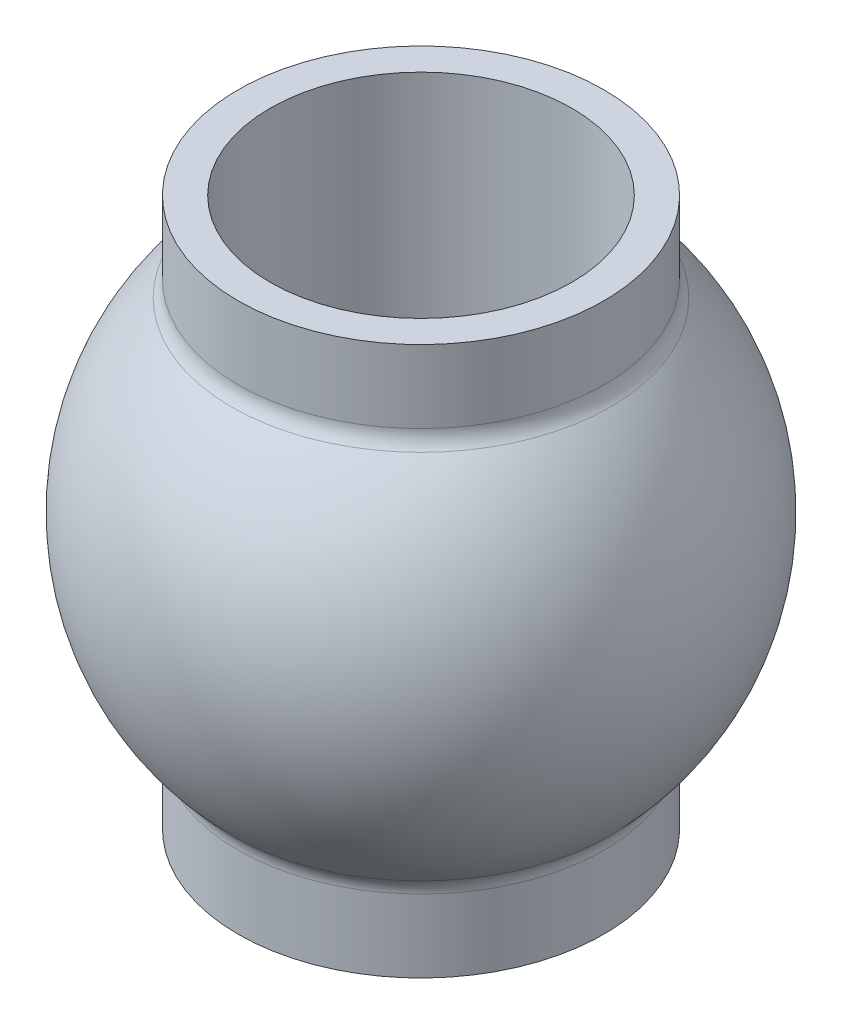
ISO-10303-21;
HEADER;
FILE_DESCRIPTION(('STEP AP214'),'2;1');
FILE_NAME('part.step','',(''),(''),'','','');
FILE_SCHEMA(('AUTOMOTIVE_DESIGN { 1 0 10303 214 1 1 1 1 }'));
ENDSEC;
DATA;
#1=APPLICATION_CONTEXT('core data for automotive mechanical design processes');
#2=APPLICATION_PROTOCOL_DEFINITION('international standard','automotive_design',2000,#1);
#3=PRODUCT_CONTEXT('',#1,'mechanical');
#4=PRODUCT('Part','Part','',(#3));
#5=PRODUCT_RELATED_PRODUCT_CATEGORY('part','',(#4));
#6=PRODUCT_DEFINITION_FORMATION('','',#4);
#7=PRODUCT_DEFINITION_CONTEXT('part definition',#1,'design');
#8=PRODUCT_DEFINITION('design','',#6,#7);
#9=PRODUCT_DEFINITION_SHAPE('','',#8);
#10=(LENGTH_UNIT() NAMED_UNIT(*) SI_UNIT(.MILLI.,.METRE.));
#11=(NAMED_UNIT(*) PLANE_ANGLE_UNIT() SI_UNIT($,.RADIAN.));
#12=(NAMED_UNIT(*) SI_UNIT($,.STERADIAN.) SOLID_ANGLE_UNIT());
#13=UNCERTAINTY_MEASURE_WITH_UNIT(LENGTH_MEASURE(1.E-05),#10,'distance_accuracy_value','');
#14=(GEOMETRIC_REPRESENTATION_CONTEXT(3) GLOBAL_UNCERTAINTY_ASSIGNED_CONTEXT((#13)) GLOBAL_UNIT_ASSIGNED_CONTEXT((#10,
#11,#12)) REPRESENTATION_CONTEXT('',''));
#15=CARTESIAN_POINT('',(0.,0.,0.));
#16=DIRECTION('',(0.,0.,1.));
#17=DIRECTION('',(1.,0.,0.));
#18=AXIS2_PLACEMENT_3D('',#15,#16,#17);
#19=CARTESIAN_POINT('',(0.,3.,0.));
#20=DIRECTION('',(0.,-1.,0.));
#21=DIRECTION('',(0.,0.,-1.));
#22=AXIS2_PLACEMENT_3D('',#19,#20,#21);
#23=PLANE('',#22);
#24=CARTESIAN_POINT('',(0.,3.,0.));
#25=DIRECTION('',(0.,1.,0.));
#26=DIRECTION('',(0.,0.,1.));
#27=AXIS2_PLACEMENT_3D('',#24,#25,#26);
#28=CIRCLE('',#27,1.65);
#29=CARTESIAN_POINT('',(0.,3.,1.65));
#30=VERTEX_POINT('',#29);
#31=EDGE_CURVE('E57',#30,#30,#28,.T.);
#32=ORIENTED_EDGE('',*,*,#31,.F.);
#33=EDGE_LOOP('',(#32));
#34=FACE_BOUND('',#33,.T.);
#35=CARTESIAN_POINT('',(0.,3.,0.));
#36=DIRECTION('',(0.,1.,0.));
#37=DIRECTION('',(0.,0.,1.));
#38=AXIS2_PLACEMENT_3D('',#35,#36,#37);
#39=CIRCLE('',#38,2.);
#40=CARTESIAN_POINT('',(0.,3.,2.));
#41=VERTEX_POINT('',#40);
#42=EDGE_CURVE('E50',#41,#41,#39,.T.);
#43=ORIENTED_EDGE('',*,*,#42,.T.);
#44=EDGE_LOOP('',(#43));
#45=FACE_BOUND('',#44,.T.);
#46=ADVANCED_FACE('F30',(#34,#45),#23,.F.);
#47=CARTESIAN_POINT('',(0.,4.18355431277578,0.));
#48=DIRECTION('',(0.,1.,0.));
#49=DIRECTION('',(0.,0.,1.));
#50=AXIS2_PLACEMENT_3D('',#47,#48,#49);
#51=CYLINDRICAL_SURFACE('',#50,2.);
#52=CARTESIAN_POINT('',(0.,2.20454076850486,0.));
#53=DIRECTION('',(0.,-1.,0.));
#54=DIRECTION('',(0.,0.,-1.));
#55=AXIS2_PLACEMENT_3D('',#52,#53,#54);
#56=CIRCLE('',#55,2.);
#57=CARTESIAN_POINT('',(0.,2.20454076850486,-2.));
#58=VERTEX_POINT('',#57);
#59=EDGE_CURVE('E10',#58,#58,#56,.F.);
#60=ORIENTED_EDGE('',*,*,#59,.T.);
#61=EDGE_LOOP('',(#60));
#62=FACE_BOUND('',#61,.T.);
#63=ORIENTED_EDGE('',*,*,#42,.F.);
#64=EDGE_LOOP('',(#63));
#65=FACE_BOUND('',#64,.T.);
#66=ADVANCED_FACE('F75',(#62,#65),#51,.T.);
#67=CARTESIAN_POINT('',(0.,0.,0.));
#68=DIRECTION('',(0.,1.,0.));
#69=DIRECTION('',(1.,0.,0.));
#70=AXIS2_PLACEMENT_3D('',#67,#68,#69);
#71=SPHERICAL_SURFACE('',#70,2.9);
#72=CARTESIAN_POINT('',(0.,-2.02957721544892,0.));
#73=DIRECTION('',(0.,1.,0.));
#74=DIRECTION('',(0.,0.,1.));
#75=AXIS2_PLACEMENT_3D('',#72,#73,#74);
#76=CIRCLE('',#75,2.07142857142857);
#77=CARTESIAN_POINT('',(2.07142857142857,-2.02957721544892,0.));
#78=VERTEX_POINT('',#77);
#79=EDGE_CURVE('E41',#78,#78,#76,.T.);
#80=CARTESIAN_POINT('',(0.,2.02957721544892,0.));
#81=DIRECTION('',(0.,-1.,0.));
#82=DIRECTION('',(0.,0.,-1.));
#83=AXIS2_PLACEMENT_3D('',#80,#81,#82);
#84=CIRCLE('',#83,2.07142857142857);
#85=CARTESIAN_POINT('',(2.07142857142857,2.02957721544892,0.));
#86=VERTEX_POINT('',#85);
#87=EDGE_CURVE('E45',#86,#86,#84,.T.);
#88=CARTESIAN_POINT('',(2.07142857142857,-2.02957721544892,0.));
#89=CARTESIAN_POINT('',(2.10420667702198,-1.99612456649257,0.));
#90=CARTESIAN_POINT('',(2.13617298715975,-1.96187663599803,0.));
#91=CARTESIAN_POINT('',(2.19841013291631,-1.89187337861782,0.));
#92=CARTESIAN_POINT('',(2.22868096853511,-1.85611805173215,0.));
#93=CARTESIAN_POINT('',(2.28745528164607,-1.78318316825493,0.));
#94=CARTESIAN_POINT('',(2.31595875913823,-1.74600361166338,0.));
#95=CARTESIAN_POINT('',(2.37113168640728,-1.67030772591639,0.));
#96=CARTESIAN_POINT('',(2.39780113618417,-1.63179139676095,0.));
#97=CARTESIAN_POINT('',(2.44924335703204,-1.55351230630763,0.));
#98=CARTESIAN_POINT('',(2.47401612810302,-1.51374954500976,0.));
#99=CARTESIAN_POINT('',(2.52160686841956,-1.43307092400676,0.));
#100=CARTESIAN_POINT('',(2.54442483766512,-1.39215506430164,0.));
#101=CARTESIAN_POINT('',(2.58805241843058,-1.3092662681936,0.));
#102=CARTESIAN_POINT('',(2.60886202995047,-1.26729333179068,0.));
#103=CARTESIAN_POINT('',(2.64842405828161,-1.18238888973957,0.));
#104=CARTESIAN_POINT('',(2.66717647509285,-1.13945738409136,0.));
#105=CARTESIAN_POINT('',(2.70258010358794,-1.05273655936215,0.));
#106=CARTESIAN_POINT('',(2.71923131527179,-1.00894724028114,0.));
#107=CARTESIAN_POINT('',(2.75039345481303,-0.920613558054732,0.));
#108=CARTESIAN_POINT('',(2.76490438267043,-0.876069194909328,0.));
#109=CARTESIAN_POINT('',(2.791751898793,-0.786329965843888,0.));
#110=CARTESIAN_POINT('',(2.80408848705819,-0.741135099923851,0.));
#111=CARTESIAN_POINT('',(2.82655837122351,-0.650200933291157,0.));
#112=CARTESIAN_POINT('',(2.83669166712365,-0.604461632578498,0.));
#113=CARTESIAN_POINT('',(2.85473118469243,-0.512545942071595,0.));
#114=CARTESIAN_POINT('',(2.86263740636108,-0.466369552277349,0.));
#115=CARTESIAN_POINT('',(2.87620422033015,-0.373688055125888,0.));
#116=CARTESIAN_POINT('',(2.88186481263057,-0.327182947768672,0.));
#117=CARTESIAN_POINT('',(2.89092708300075,-0.233953158477716,0.));
#118=CARTESIAN_POINT('',(2.8943287610705,-0.187228476543975,0.));
#119=CARTESIAN_POINT('',(2.89886521957013,-0.0936691964068227,0.));
#120=CARTESIAN_POINT('',(2.9,-0.046834598203411,0.));
#121=CARTESIAN_POINT('',(2.9,0.0468345982034123,0.));
#122=CARTESIAN_POINT('',(2.89886521957013,0.093669196406824,0.));
#123=CARTESIAN_POINT('',(2.8943287610705,0.187228476543977,0.));
#124=CARTESIAN_POINT('',(2.89092708300075,0.233953158477717,0.));
#125=CARTESIAN_POINT('',(2.88186481263057,0.327182947768674,0.));
#126=CARTESIAN_POINT('',(2.87620422033015,0.373688055125889,0.));
#127=CARTESIAN_POINT('',(2.86263740636108,0.46636955227735,0.));
#128=CARTESIAN_POINT('',(2.85473118469243,0.512545942071596,0.));
#129=CARTESIAN_POINT('',(2.83669166712365,0.6044616325785,0.));
#130=CARTESIAN_POINT('',(2.82655837122351,0.650200933291158,0.));
#131=CARTESIAN_POINT('',(2.80408848705819,0.741135099923853,0.));
#132=CARTESIAN_POINT('',(2.791751898793,0.786329965843889,0.));
#133=CARTESIAN_POINT('',(2.76490438267043,0.87606919490933,0.));
#134=CARTESIAN_POINT('',(2.75039345481303,0.920613558054733,0.));
#135=CARTESIAN_POINT('',(2.71923131527179,1.00894724028115,0.));
#136=CARTESIAN_POINT('',(2.70258010358794,1.05273655936215,0.));
#137=CARTESIAN_POINT('',(2.66717647509285,1.13945738409137,0.));
#138=CARTESIAN_POINT('',(2.64842405828161,1.18238888973957,0.));
#139=CARTESIAN_POINT('',(2.60886202995047,1.26729333179069,0.));
#140=CARTESIAN_POINT('',(2.58805241843058,1.3092662681936,0.));
#141=CARTESIAN_POINT('',(2.54442483766512,1.39215506430164,0.));
#142=CARTESIAN_POINT('',(2.52160686841956,1.43307092400676,0.));
#143=CARTESIAN_POINT('',(2.47401612810302,1.51374954500976,0.));
#144=CARTESIAN_POINT('',(2.44924335703204,1.55351230630764,0.));
#145=CARTESIAN_POINT('',(2.39780113618417,1.63179139676095,0.));
#146=CARTESIAN_POINT('',(2.37113168640728,1.67030772591639,0.));
#147=CARTESIAN_POINT('',(2.31595875913823,1.74600361166338,0.));
#148=CARTESIAN_POINT('',(2.28745528164607,1.78318316825493,0.));
#149=CARTESIAN_POINT('',(2.22868096853511,1.85611805173215,0.));
#150=CARTESIAN_POINT('',(2.19841013291631,1.89187337861782,0.));
#151=CARTESIAN_POINT('',(2.13617298715975,1.96187663599803,0.));
#152=CARTESIAN_POINT('',(2.10420667702198,1.99612456649257,0.));
#153=CARTESIAN_POINT('',(2.07142857142857,2.02957721544892,0.));
#154=B_SPLINE_CURVE_WITH_KNOTS('',3,(#88,#89,#90,#91,#92,#93,#94,#95,#96,#97,#98,#99,#100,#101,
#102,#103,#104,#105,#106,#107,#108,#109,#110,#111,#112,#113,#114,#115,#116,#117,#118,#119,#120,
#121,#122,#123,#124,#125,#126,#127,#128,#129,#130,#131,#132,#133,#134,#135,#136,#137,#138,#139,
#140,#141,#142,#143,#144,#145,#146,#147,#148,#149,#150,#151,#152,#153),.UNSPECIFIED.,.F.,.F.,(4,
2,2,2,2,2,2,2,2,2,2,2,2,2,2,2,2,2,2,2,2,2,2,2,2,2,2,2,2,2,2,2,4),(0.,0.140490057093638,
0.280980114187275,0.421470171280913,0.561960228374551,0.702450285468188,0.842940342561826,
0.983430399655463,1.1239204567491,1.26441051384274,1.40490057093638,1.54539062803001,
1.68588068512365,1.82637074221729,1.96686079931093,2.10735085640456,2.2478409134982,
2.38833097059184,2.52882102768548,2.66931108477911,2.80980114187275,2.95029119896639,
3.09078125606003,3.23127131315367,3.3717613702473,3.51225142734094,3.65274148443458,
3.79323154152822,3.93372159862185,4.07421165571549,4.21470171280913,4.35519176990277,
4.4956818269964),.UNSPECIFIED.);
#155=EDGE_CURVE('BSEAM80',#78,#86,#154,.T.);
#156=ORIENTED_EDGE('',*,*,#79,.T.);
#157=ORIENTED_EDGE('',*,*,#87,.T.);
#158=ORIENTED_EDGE('',*,*,#155,.T.);
#159=ORIENTED_EDGE('',*,*,#155,.F.);
#160=EDGE_LOOP('',(#156,#158,#157,#159));
#161=FACE_BOUND('',#160,.T.);
#162=ADVANCED_FACE('F80',(#161),#71,.T.);
#163=CARTESIAN_POINT('',(0.,4.18355431277578,0.));
#164=DIRECTION('',(0.,1.,0.));
#165=DIRECTION('',(0.,0.,1.));
#166=AXIS2_PLACEMENT_3D('',#163,#164,#165);
#167=CYLINDRICAL_SURFACE('',#166,2.);
#168=CARTESIAN_POINT('',(0.,-2.20454076850486,0.));
#169=DIRECTION('',(0.,1.,0.));
#170=DIRECTION('',(0.,0.,1.));
#171=AXIS2_PLACEMENT_3D('',#168,#169,#170);
#172=CIRCLE('',#171,2.);
#173=CARTESIAN_POINT('',(0.,-2.20454076850486,2.));
#174=VERTEX_POINT('',#173);
#175=EDGE_CURVE('E37',#174,#174,#172,.F.);
#176=ORIENTED_EDGE('',*,*,#175,.T.);
#177=EDGE_LOOP('',(#176));
#178=FACE_BOUND('',#177,.T.);
#179=CARTESIAN_POINT('',(0.,-3.,0.));
#180=DIRECTION('',(0.,1.,0.));
#181=DIRECTION('',(0.,0.,1.));
#182=AXIS2_PLACEMENT_3D('',#179,#180,#181);
#183=CIRCLE('',#182,2.);
#184=CARTESIAN_POINT('',(0.,-3.,2.));
#185=VERTEX_POINT('',#184);
#186=EDGE_CURVE('E53',#185,#185,#183,.T.);
#187=ORIENTED_EDGE('',*,*,#186,.T.);
#188=EDGE_LOOP('',(#187));
#189=FACE_BOUND('',#188,.T.);
#190=ADVANCED_FACE('F85',(#178,#189),#167,.T.);
#191=CARTESIAN_POINT('',(2.,-3.,0.));
#192=DIRECTION('',(0.,1.,0.));
#193=DIRECTION('',(0.,0.,1.));
#194=AXIS2_PLACEMENT_3D('',#191,#192,#193);
#195=PLANE('',#194);
#196=CARTESIAN_POINT('',(0.,-3.,0.));
#197=DIRECTION('',(0.,1.,0.));
#198=DIRECTION('',(0.,0.,1.));
#199=AXIS2_PLACEMENT_3D('',#196,#197,#198);
#200=CIRCLE('',#199,1.65);
#201=CARTESIAN_POINT('',(0.,-3.,1.65));
#202=VERTEX_POINT('',#201);
#203=EDGE_CURVE('E56',#202,#202,#200,.T.);
#204=ORIENTED_EDGE('',*,*,#203,.T.);
#205=EDGE_LOOP('',(#204));
#206=FACE_BOUND('',#205,.T.);
#207=ORIENTED_EDGE('',*,*,#186,.F.);
#208=EDGE_LOOP('',(#207));
#209=FACE_BOUND('',#208,.T.);
#210=ADVANCED_FACE('F63',(#206,#209),#195,.F.);
#211=CARTESIAN_POINT('',(0.,-3.,0.));
#212=DIRECTION('',(0.,1.,0.));
#213=DIRECTION('',(0.,0.,1.));
#214=AXIS2_PLACEMENT_3D('',#211,#212,#213);
#215=CYLINDRICAL_SURFACE('',#214,1.65);
#216=ORIENTED_EDGE('',*,*,#203,.F.);
#217=EDGE_LOOP('',(#216));
#218=FACE_BOUND('',#217,.T.);
#219=ORIENTED_EDGE('',*,*,#31,.T.);
#220=EDGE_LOOP('',(#219));
#221=FACE_BOUND('',#220,.T.);
#222=ADVANCED_FACE('F66',(#218,#221),#215,.F.);
#223=CARTESIAN_POINT('',(0.,-2.20454076850486,0.));
#224=DIRECTION('',(0.,1.,0.));
#225=DIRECTION('',(0.,0.,1.));
#226=AXIS2_PLACEMENT_3D('',#223,#224,#225);
#227=TOROIDAL_SURFACE('',#226,2.25,0.25);
#228=ORIENTED_EDGE('',*,*,#175,.F.);
#229=EDGE_LOOP('',(#228));
#230=FACE_BOUND('',#229,.T.);
#231=ORIENTED_EDGE('',*,*,#79,.F.);
#232=EDGE_LOOP('',(#231));
#233=FACE_BOUND('',#232,.T.);
#234=ADVANCED_FACE('F69',(#230,#233),#227,.F.);
#235=CARTESIAN_POINT('',(0.,2.20454076850486,0.));
#236=DIRECTION('',(0.,-1.,0.));
#237=DIRECTION('',(0.,0.,-1.));
#238=AXIS2_PLACEMENT_3D('',#235,#236,#237);
#239=TOROIDAL_SURFACE('',#238,2.25,0.25);
#240=ORIENTED_EDGE('',*,*,#87,.F.);
#241=EDGE_LOOP('',(#240));
#242=FACE_BOUND('',#241,.T.);
#243=ORIENTED_EDGE('',*,*,#59,.F.);
#244=EDGE_LOOP('',(#243));
#245=FACE_BOUND('',#244,.T.);
#246=ADVANCED_FACE('F32',(#242,#245),#239,.F.);
#247=CLOSED_SHELL('',(#46,#66,#162,#190,#210,#222,#234,#246));
#248=MANIFOLD_SOLID_BREP('B2',#247);
#249=ADVANCED_BREP_SHAPE_REPRESENTATION('',(#18,#248),#14);
#250=SHAPE_DEFINITION_REPRESENTATION(#9,#249);
ENDSEC;
END-ISO-10303-21;
